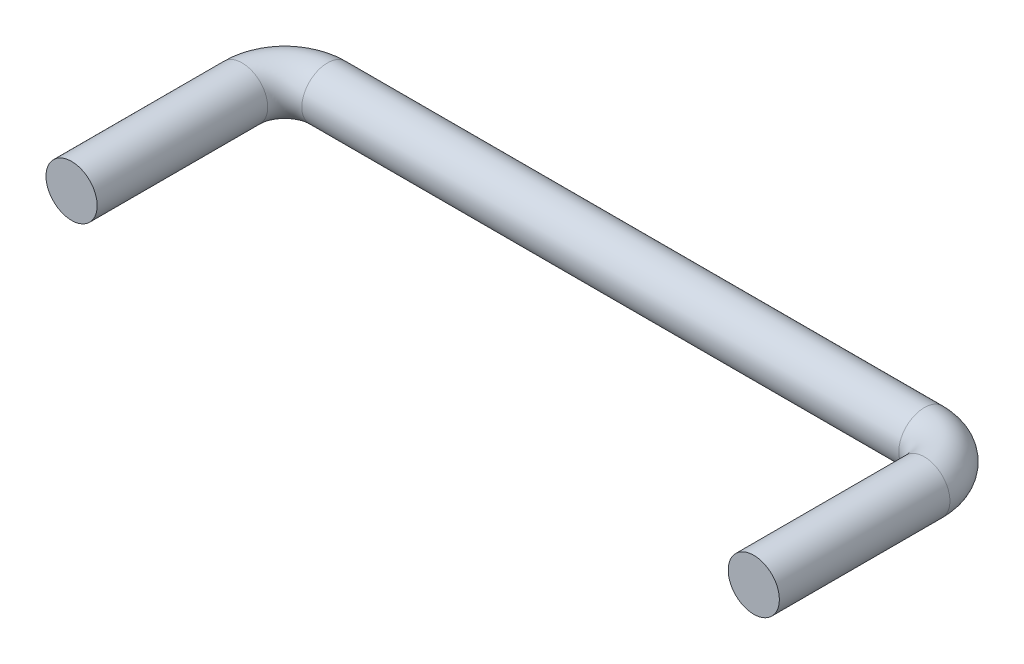
ISO-10303-21;
HEADER;
FILE_DESCRIPTION(('STEP AP214'),'2;1');
FILE_NAME('part.step','',(''),(''),'','','');
FILE_SCHEMA(('AUTOMOTIVE_DESIGN { 1 0 10303 214 1 1 1 1 }'));
ENDSEC;
DATA;
#1=APPLICATION_CONTEXT('core data for automotive mechanical design processes');
#2=APPLICATION_PROTOCOL_DEFINITION('international standard','automotive_design',2000,#1);
#3=PRODUCT_CONTEXT('',#1,'mechanical');
#4=PRODUCT('Part','Part','',(#3));
#5=PRODUCT_RELATED_PRODUCT_CATEGORY('part','',(#4));
#6=PRODUCT_DEFINITION_FORMATION('','',#4);
#7=PRODUCT_DEFINITION_CONTEXT('part definition',#1,'design');
#8=PRODUCT_DEFINITION('design','',#6,#7);
#9=PRODUCT_DEFINITION_SHAPE('','',#8);
#10=(LENGTH_UNIT() NAMED_UNIT(*) SI_UNIT(.MILLI.,.METRE.));
#11=(NAMED_UNIT(*) PLANE_ANGLE_UNIT() SI_UNIT($,.RADIAN.));
#12=(NAMED_UNIT(*) SI_UNIT($,.STERADIAN.) SOLID_ANGLE_UNIT());
#13=UNCERTAINTY_MEASURE_WITH_UNIT(LENGTH_MEASURE(1.E-05),#10,'distance_accuracy_value','');
#14=(GEOMETRIC_REPRESENTATION_CONTEXT(3) GLOBAL_UNCERTAINTY_ASSIGNED_CONTEXT((#13)) GLOBAL_UNIT_ASSIGNED_CONTEXT((#10,
#11,#12)) REPRESENTATION_CONTEXT('',''));
#15=CARTESIAN_POINT('',(0.,0.,0.));
#16=DIRECTION('',(0.,0.,1.));
#17=DIRECTION('',(1.,0.,0.));
#18=AXIS2_PLACEMENT_3D('',#15,#16,#17);
#19=CARTESIAN_POINT('',(-20.,0.,30.));
#20=DIRECTION('',(0.,0.,1.));
#21=DIRECTION('',(1.,0.,0.));
#22=AXIS2_PLACEMENT_3D('',#19,#20,#21);
#23=CYLINDRICAL_SURFACE('',#22,2.99999999999999);
#24=CARTESIAN_POINT('',(-20.,0.,30.));
#25=DIRECTION('',(0.,0.,1.));
#26=DIRECTION('',(1.,0.,0.));
#27=AXIS2_PLACEMENT_3D('',#24,#25,#26);
#28=CIRCLE('',#27,2.99999999999999);
#29=CARTESIAN_POINT('',(-17.,0.,30.));
#30=VERTEX_POINT('',#29);
#31=EDGE_CURVE('E37',#30,#30,#28,.T.);
#32=ORIENTED_EDGE('',*,*,#31,.T.);
#33=EDGE_LOOP('',(#32));
#34=FACE_BOUND('',#33,.T.);
#35=CARTESIAN_POINT('',(-20.,0.,50.));
#36=DIRECTION('',(0.,0.,1.));
#37=DIRECTION('',(1.,0.,0.));
#38=AXIS2_PLACEMENT_3D('',#35,#36,#37);
#39=CIRCLE('',#38,2.99999999999999);
#40=CARTESIAN_POINT('',(-17.,0.,50.));
#41=VERTEX_POINT('',#40);
#42=EDGE_CURVE('E10',#41,#41,#39,.T.);
#43=ORIENTED_EDGE('',*,*,#42,.F.);
#44=EDGE_LOOP('',(#43));
#45=FACE_BOUND('',#44,.T.);
#46=ADVANCED_FACE('F31',(#34,#45),#23,.T.);
#47=CARTESIAN_POINT('',(-25.,0.,30.));
#48=DIRECTION('',(0.,-1.,0.));
#49=DIRECTION('',(0.,0.,-1.));
#50=AXIS2_PLACEMENT_3D('',#47,#48,#49);
#51=TOROIDAL_SURFACE('',#50,4.99999999999999,2.99999999999999);
#52=CARTESIAN_POINT('',(-25.,0.,25.));
#53=DIRECTION('',(1.,0.,0.));
#54=DIRECTION('',(0.,0.,-1.));
#55=AXIS2_PLACEMENT_3D('',#52,#53,#54);
#56=CIRCLE('',#55,2.99999999999999);
#57=CARTESIAN_POINT('',(-25.,0.,22.));
#58=VERTEX_POINT('',#57);
#59=EDGE_CURVE('E41',#58,#58,#56,.T.);
#60=CARTESIAN_POINT('',(-25.,0.,30.));
#61=DIRECTION('',(0.,-1.,0.));
#62=DIRECTION('',(0.,0.,-1.));
#63=AXIS2_PLACEMENT_3D('',#60,#61,#62);
#64=CIRCLE('',#63,7.99999999999999);
#65=EDGE_CURVE('',#58,#30,#64,.T.);
#66=ORIENTED_EDGE('',*,*,#59,.T.);
#67=ORIENTED_EDGE('',*,*,#31,.F.);
#68=ORIENTED_EDGE('',*,*,#65,.T.);
#69=ORIENTED_EDGE('',*,*,#65,.F.);
#70=EDGE_LOOP('',(#66,#68,#67,#69));
#71=FACE_BOUND('',#70,.T.);
#72=ADVANCED_FACE('F75',(#71),#51,.T.);
#73=CARTESIAN_POINT('',(-95.,0.,25.));
#74=DIRECTION('',(1.,0.,0.));
#75=DIRECTION('',(0.,0.,-1.));
#76=AXIS2_PLACEMENT_3D('',#73,#74,#75);
#77=CYLINDRICAL_SURFACE('',#76,2.99999999999999);
#78=CARTESIAN_POINT('',(-95.,0.,25.));
#79=DIRECTION('',(1.,0.,0.));
#80=DIRECTION('',(0.,0.,-1.));
#81=AXIS2_PLACEMENT_3D('',#78,#79,#80);
#82=CIRCLE('',#81,2.99999999999999);
#83=CARTESIAN_POINT('',(-95.,0.,22.));
#84=VERTEX_POINT('',#83);
#85=EDGE_CURVE('E45',#84,#84,#82,.T.);
#86=ORIENTED_EDGE('',*,*,#85,.T.);
#87=EDGE_LOOP('',(#86));
#88=FACE_BOUND('',#87,.T.);
#89=ORIENTED_EDGE('',*,*,#59,.F.);
#90=EDGE_LOOP('',(#89));
#91=FACE_BOUND('',#90,.T.);
#92=ADVANCED_FACE('F79',(#88,#91),#77,.T.);
#93=CARTESIAN_POINT('',(-95.,0.,30.));
#94=DIRECTION('',(0.,-1.,0.));
#95=DIRECTION('',(0.,0.,-1.));
#96=AXIS2_PLACEMENT_3D('',#93,#94,#95);
#97=TOROIDAL_SURFACE('',#96,5.,2.99999999999999);
#98=CARTESIAN_POINT('',(-100.,0.,30.));
#99=DIRECTION('',(0.,0.,-1.));
#100=DIRECTION('',(-1.,0.,0.));
#101=AXIS2_PLACEMENT_3D('',#98,#99,#100);
#102=CIRCLE('',#101,2.99999999999999);
#103=CARTESIAN_POINT('',(-103.,0.,30.));
#104=VERTEX_POINT('',#103);
#105=EDGE_CURVE('E50',#104,#104,#102,.T.);
#106=CARTESIAN_POINT('',(-95.,0.,30.));
#107=DIRECTION('',(0.,-1.,0.));
#108=DIRECTION('',(0.,0.,-1.));
#109=AXIS2_PLACEMENT_3D('',#106,#107,#108);
#110=CIRCLE('',#109,8.);
#111=EDGE_CURVE('',#104,#84,#110,.T.);
#112=ORIENTED_EDGE('',*,*,#105,.T.);
#113=ORIENTED_EDGE('',*,*,#85,.F.);
#114=ORIENTED_EDGE('',*,*,#111,.T.);
#115=ORIENTED_EDGE('',*,*,#111,.F.);
#116=EDGE_LOOP('',(#112,#114,#113,#115));
#117=FACE_BOUND('',#116,.T.);
#118=ADVANCED_FACE('F57',(#117),#97,.T.);
#119=CARTESIAN_POINT('',(-100.,0.,30.));
#120=DIRECTION('',(0.,0.,1.));
#121=DIRECTION('',(1.,0.,0.));
#122=AXIS2_PLACEMENT_3D('',#119,#120,#121);
#123=CYLINDRICAL_SURFACE('',#122,2.99999999999999);
#124=ORIENTED_EDGE('',*,*,#105,.F.);
#125=EDGE_LOOP('',(#124));
#126=FACE_BOUND('',#125,.T.);
#127=CARTESIAN_POINT('',(-100.,0.,50.));
#128=DIRECTION('',(0.,0.,-1.));
#129=DIRECTION('',(-1.,0.,0.));
#130=AXIS2_PLACEMENT_3D('',#127,#128,#129);
#131=CIRCLE('',#130,2.99999999999999);
#132=CARTESIAN_POINT('',(-103.,0.,50.));
#133=VERTEX_POINT('',#132);
#134=EDGE_CURVE('E51',#133,#133,#131,.T.);
#135=ORIENTED_EDGE('',*,*,#134,.T.);
#136=EDGE_LOOP('',(#135));
#137=FACE_BOUND('',#136,.T.);
#138=ADVANCED_FACE('F60',(#126,#137),#123,.T.);
#139=CARTESIAN_POINT('',(-20.,0.,50.));
#140=DIRECTION('',(0.,0.,1.));
#141=DIRECTION('',(1.,0.,0.));
#142=AXIS2_PLACEMENT_3D('',#139,#140,#141);
#143=PLANE('',#142);
#144=ORIENTED_EDGE('',*,*,#42,.T.);
#145=EDGE_LOOP('',(#144));
#146=FACE_BOUND('',#145,.T.);
#147=ADVANCED_FACE('F63',(#146),#143,.T.);
#148=CARTESIAN_POINT('',(-100.,0.,50.));
#149=DIRECTION('',(0.,0.,-1.));
#150=DIRECTION('',(-1.,0.,0.));
#151=AXIS2_PLACEMENT_3D('',#148,#149,#150);
#152=PLANE('',#151);
#153=ORIENTED_EDGE('',*,*,#134,.F.);
#154=EDGE_LOOP('',(#153));
#155=FACE_BOUND('',#154,.T.);
#156=ADVANCED_FACE('F67',(#155),#152,.F.);
#157=CLOSED_SHELL('',(#46,#72,#92,#118,#138,#147,#156));
#158=MANIFOLD_SOLID_BREP('B2',#157);
#159=ADVANCED_BREP_SHAPE_REPRESENTATION('',(#18,#158),#14);
#160=SHAPE_DEFINITION_REPRESENTATION(#9,#159);
ENDSEC;
END-ISO-10303-21;
